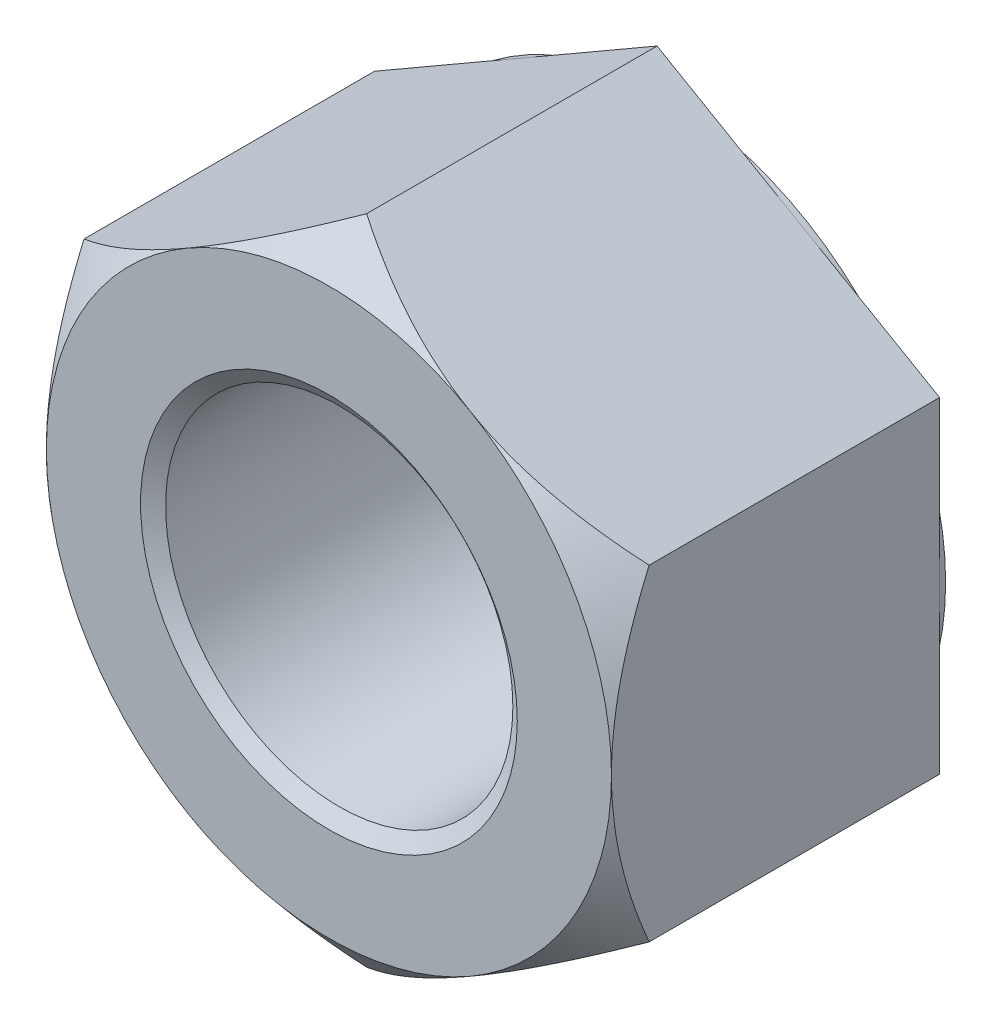
ISO-10303-21;
HEADER;
FILE_DESCRIPTION(('STEP AP214'),'2;1');
FILE_NAME('part.step','',(''),(''),'','','');
FILE_SCHEMA(('AUTOMOTIVE_DESIGN { 1 0 10303 214 1 1 1 1 }'));
ENDSEC;
DATA;
#1=APPLICATION_CONTEXT('core data for automotive mechanical design processes');
#2=APPLICATION_PROTOCOL_DEFINITION('international standard','automotive_design',2000,#1);
#3=PRODUCT_CONTEXT('',#1,'mechanical');
#4=PRODUCT('Part','Part','',(#3));
#5=PRODUCT_RELATED_PRODUCT_CATEGORY('part','',(#4));
#6=PRODUCT_DEFINITION_FORMATION('','',#4);
#7=PRODUCT_DEFINITION_CONTEXT('part definition',#1,'design');
#8=PRODUCT_DEFINITION('design','',#6,#7);
#9=PRODUCT_DEFINITION_SHAPE('','',#8);
#10=(LENGTH_UNIT() NAMED_UNIT(*) SI_UNIT(.MILLI.,.METRE.));
#11=(NAMED_UNIT(*) PLANE_ANGLE_UNIT() SI_UNIT($,.RADIAN.));
#12=(NAMED_UNIT(*) SI_UNIT($,.STERADIAN.) SOLID_ANGLE_UNIT());
#13=UNCERTAINTY_MEASURE_WITH_UNIT(LENGTH_MEASURE(1.E-05),#10,'distance_accuracy_value','');
#14=(GEOMETRIC_REPRESENTATION_CONTEXT(3) GLOBAL_UNCERTAINTY_ASSIGNED_CONTEXT((#13)) GLOBAL_UNIT_ASSIGNED_CONTEXT((#10,
#11,#12)) REPRESENTATION_CONTEXT('',''));
#15=CARTESIAN_POINT('',(0.,0.,0.));
#16=DIRECTION('',(0.,0.,1.));
#17=DIRECTION('',(1.,0.,0.));
#18=AXIS2_PLACEMENT_3D('',#15,#16,#17);
#19=CARTESIAN_POINT('',(0.,0.,-22.5298));
#20=DIRECTION('',(0.,0.,1.));
#21=DIRECTION('',(1.,0.,0.));
#22=AXIS2_PLACEMENT_3D('',#19,#20,#21);
#23=CYLINDRICAL_SURFACE('',#22,11.70813);
#24=CARTESIAN_POINT('',(0.,0.,-0.694514850924055));
#25=DIRECTION('',(0.,0.,1.));
#26=DIRECTION('',(1.,0.,0.));
#27=AXIS2_PLACEMENT_3D('',#24,#25,#26);
#28=CIRCLE('',#27,11.70813);
#29=CARTESIAN_POINT('',(11.70813,0.,-0.694514850924055));
#30=VERTEX_POINT('',#29);
#31=EDGE_CURVE('E150',#30,#30,#28,.F.);
#32=ORIENTED_EDGE('',*,*,#31,.F.);
#33=EDGE_LOOP('',(#32));
#34=FACE_BOUND('',#33,.T.);
#35=CARTESIAN_POINT('',(0.,0.,-21.8098851490759));
#36=DIRECTION('',(0.,0.,-1.));
#37=DIRECTION('',(-1.,0.,0.));
#38=AXIS2_PLACEMENT_3D('',#35,#36,#37);
#39=CIRCLE('',#38,11.70813);
#40=CARTESIAN_POINT('',(-11.70813,0.,-21.8098851490759));
#41=VERTEX_POINT('',#40);
#42=EDGE_CURVE('E38',#41,#41,#39,.F.);
#43=ORIENTED_EDGE('',*,*,#42,.F.);
#44=EDGE_LOOP('',(#43));
#45=FACE_BOUND('',#44,.T.);
#46=ADVANCED_FACE('F33',(#34,#45),#23,.F.);
#47=CARTESIAN_POINT('',(0.,21.9970452561247,-22.5298));
#48=DIRECTION('',(-0.5,0.866025403784438,0.));
#49=DIRECTION('',(-0.866025403784438,-0.5,0.));
#50=AXIS2_PLACEMENT_3D('',#47,#48,#49);
#51=PLANE('',#50);
#52=DIRECTION('',(0.,0.,1.));
#53=VECTOR('',#52,1.);
#54=CARTESIAN_POINT('',(-19.05,10.9985226280624,-22.5298));
#55=LINE('',#54,#53);
#56=CARTESIAN_POINT('',(-19.05,10.9985226280624,-22.1234));
#57=VERTEX_POINT('',#56);
#58=CARTESIAN_POINT('',(-19.05,10.9985226280624,-2.54));
#59=VERTEX_POINT('',#58);
#60=EDGE_CURVE('E282',#57,#59,#55,.T.);
#61=ORIENTED_EDGE('',*,*,#60,.T.);
#62=CARTESIAN_POINT('',(-19.0502,10.9984071580085,-2.54009952213849));
#63=CARTESIAN_POINT('',(-18.6766639855738,11.2140682764895,-2.35425451379221));
#64=CARTESIAN_POINT('',(-18.3004987158653,11.4312473962155,-2.17523809705124));
#65=CARTESIAN_POINT('',(-17.5425520403765,11.8688481133404,-1.83307180263063));
#66=CARTESIAN_POINT('',(-17.1607674659696,12.0892715401466,-1.66993130516963));
#67=CARTESIAN_POINT('',(-16.3897113206679,12.5344410131968,-1.3611684029933));
#68=CARTESIAN_POINT('',(-16.0004115857015,12.7592033199752,-1.21563910791352));
#69=CARTESIAN_POINT('',(-15.216398258664,13.2118536253885,-0.945694898655021));
#70=CARTESIAN_POINT('',(-14.8216855849419,13.4397410938145,-0.82127644959926));
#71=CARTESIAN_POINT('',(-14.0342916648806,13.8943431855202,-0.598191618896152));
#72=CARTESIAN_POINT('',(-13.6417004785289,14.1210058126418,-0.499104223518349));
#73=CARTESIAN_POINT('',(-12.852318337895,14.5767558040303,-0.326215026473438));
#74=CARTESIAN_POINT('',(-12.4555272588972,14.8058432403017,-0.252413977867097));
#75=CARTESIAN_POINT('',(-11.6597061794376,15.2653107547545,-0.132260395738475));
#76=CARTESIAN_POINT('',(-11.2606830445542,15.4956868690923,-0.0858477001342909));
#77=CARTESIAN_POINT('',(-10.4609191442254,15.9574307722353,-0.0216165971278409));
#78=CARTESIAN_POINT('',(-10.0601785045138,16.188798488448,-0.00379613124170322));
#79=CARTESIAN_POINT('',(-9.31450866794628,16.6193111693169,0.00225310916662124));
#80=CARTESIAN_POINT('',(-8.96959863448719,16.8184450699807,-0.00573407810545133));
#81=CARTESIAN_POINT('',(-8.28065896680875,17.2162045725702,-0.0430781586509624));
#82=CARTESIAN_POINT('',(-7.9366293034092,17.4148301913432,-0.0724343341879413));
#83=CARTESIAN_POINT('',(-7.25012577160561,17.8111831902296,-0.151878622342599));
#84=CARTESIAN_POINT('',(-6.90765324370967,18.0089097964004,-0.20198206882495));
#85=CARTESIAN_POINT('',(-6.22530999936825,18.4028608522006,-0.321846286833533));
#86=CARTESIAN_POINT('',(-5.88543932042931,18.5990852801757,-0.391607341184942));
#87=CARTESIAN_POINT('',(-5.20886184729644,18.9897074664166,-0.549433846264761));
#88=CARTESIAN_POINT('',(-4.87215552765403,19.1841049507,-0.63750199808612));
#89=CARTESIAN_POINT('',(-4.2023492206137,19.5708178023746,-0.830408468804725));
#90=CARTESIAN_POINT('',(-3.86924977950534,19.7631328543654,-0.935249291145561));
#91=CARTESIAN_POINT('',(-2.87609571840607,20.3365306188879,-1.2724157037246));
#92=CARTESIAN_POINT('',(-2.22175506329323,20.714314372259,-1.52748945926886));
#93=CARTESIAN_POINT('',(-1.30991685119032,21.240764409474,-1.92140953010559));
#94=CARTESIAN_POINT('',(-1.04568446920167,21.3933190463438,-2.04022275177846));
#95=CARTESIAN_POINT('',(-0.520499849760543,21.6965345277523,-2.28495691248877));
#96=CARTESIAN_POINT('',(-0.259540846314214,21.8471992786395,-2.41085847151859));
#97=CARTESIAN_POINT('',(0.000200000000005041,21.9971607261786,-2.54009952213847));
#98=B_SPLINE_CURVE_WITH_KNOTS('',3,(#62,#63,#64,#65,#66,#67,#68,#69,#70,#71,#72,#73,#74,#75,#76,
#77,#78,#79,#80,#81,#82,#83,#84,#85,#86,#87,#88,#89,#90,#91,#92,#93,#94,#95,#96,#97),
.UNSPECIFIED.,.F.,.F.,(4,2,2,2,2,2,2,2,2,2,2,2,2,2,2,2,2,4),(0.,1.40903860406288,
2.81890474120159,4.23592620850326,5.65271016991147,7.04413924364017,8.43560975236122,
9.82401222617536,11.212314738133,12.4067918232825,13.6012287904728,14.7965501205998,
15.9918886493724,17.1874036678946,18.3830972925295,20.7729660282076,21.7551941199548,
22.7348561182917),.UNSPECIFIED.);
#99=CARTESIAN_POINT('',(-9.52500000000001,16.4977839420936,0.));
#100=VERTEX_POINT('',#99);
#101=EDGE_CURVE('E136',#59,#100,#98,.T.);
#102=ORIENTED_EDGE('',*,*,#101,.T.);
#103=CARTESIAN_POINT('',(0.,21.9970452561247,-2.54));
#104=VERTEX_POINT('',#103);
#105=EDGE_CURVE('E163',#100,#104,#98,.T.);
#106=ORIENTED_EDGE('',*,*,#105,.T.);
#107=DIRECTION('',(0.,0.,1.));
#108=VECTOR('',#107,1.);
#109=CARTESIAN_POINT('',(0.,21.9970452561247,-22.5298));
#110=LINE('',#109,#108);
#111=CARTESIAN_POINT('',(0.,21.9970452561247,-22.1234));
#112=VERTEX_POINT('',#111);
#113=EDGE_CURVE('E270',#112,#104,#110,.T.);
#114=ORIENTED_EDGE('',*,*,#113,.F.);
#115=DIRECTION('',(-0.866025403784438,-0.5,0.));
#116=VECTOR('',#115,1.);
#117=CARTESIAN_POINT('',(0.,21.9970452561247,-22.1234));
#118=LINE('',#117,#116);
#119=CARTESIAN_POINT('',(-9.52500000000001,16.4977839420936,-22.1234));
#120=VERTEX_POINT('',#119);
#121=EDGE_CURVE('E258',#112,#120,#118,.T.);
#122=ORIENTED_EDGE('',*,*,#121,.T.);
#123=EDGE_CURVE('E254',#120,#57,#118,.T.);
#124=ORIENTED_EDGE('',*,*,#123,.T.);
#125=EDGE_LOOP('',(#61,#102,#106,#114,#122,#124));
#126=FACE_BOUND('',#125,.T.);
#127=ADVANCED_FACE('F35',(#126),#51,.T.);
#128=CARTESIAN_POINT('',(19.05,10.9985226280624,-22.5298));
#129=DIRECTION('',(0.5,0.866025403784439,0.));
#130=DIRECTION('',(-0.866025403784439,0.5,0.));
#131=AXIS2_PLACEMENT_3D('',#128,#129,#130);
#132=PLANE('',#131);
#133=ORIENTED_EDGE('',*,*,#113,.T.);
#134=CARTESIAN_POINT('',(-0.000200000000004576,21.9971607261786,-2.5400995221385));
#135=CARTESIAN_POINT('',(0.373336014426207,21.7814996076976,-2.35425451379222));
#136=CARTESIAN_POINT('',(0.749501284134725,21.5643204879716,-2.17523809705124));
#137=CARTESIAN_POINT('',(1.50744795962354,21.1267197708467,-1.83307180263064));
#138=CARTESIAN_POINT('',(1.88923253403042,20.9062963440405,-1.66993130516964));
#139=CARTESIAN_POINT('',(2.66028867933205,20.4611268709903,-1.3611684029933));
#140=CARTESIAN_POINT('',(3.04958841429848,20.236364564212,-1.21563910791353));
#141=CARTESIAN_POINT('',(3.83360174133601,19.7837142587986,-0.945694898655026));
#142=CARTESIAN_POINT('',(4.22831441505808,19.5558267903726,-0.821276449599265));
#143=CARTESIAN_POINT('',(5.01570833511943,19.1012246986669,-0.598191618896155));
#144=CARTESIAN_POINT('',(5.4082995214711,18.8745620715453,-0.499104223518351));
#145=CARTESIAN_POINT('',(6.19768166210499,18.4188120801568,-0.326215026473441));
#146=CARTESIAN_POINT('',(6.59447274110284,18.1897246438854,-0.252413977867101));
#147=CARTESIAN_POINT('',(7.39029382056238,17.7302571294326,-0.132260395738479));
#148=CARTESIAN_POINT('',(7.78931695544577,17.4998810150948,-0.0858477001342926));
#149=CARTESIAN_POINT('',(8.58908085577464,17.0381371119518,-0.0216165971278422));
#150=CARTESIAN_POINT('',(8.98982149548619,16.8067693957391,-0.00379613124170649));
#151=CARTESIAN_POINT('',(9.73549133205373,16.3762567148703,0.00225310916661852));
#152=CARTESIAN_POINT('',(10.0804013655128,16.1771228142064,-0.00573407810545215));
#153=CARTESIAN_POINT('',(10.7693410331913,15.7793633116169,-0.0430781586509615));
#154=CARTESIAN_POINT('',(11.1133706965908,15.5807376928439,-0.0724343341879406));
#155=CARTESIAN_POINT('',(11.7998742283944,15.1843846939575,-0.1518786223426));
#156=CARTESIAN_POINT('',(12.1423467562903,14.9866580877867,-0.201982068824953));
#157=CARTESIAN_POINT('',(12.8246900006318,14.5927070319865,-0.321846286833535));
#158=CARTESIAN_POINT('',(13.1645606795707,14.3964826040114,-0.391607341184942));
#159=CARTESIAN_POINT('',(13.8411381527036,14.0058604177705,-0.549433846264761));
#160=CARTESIAN_POINT('',(14.177844472346,13.8114629334871,-0.637501998086123));
#161=CARTESIAN_POINT('',(14.8476507793863,13.4247500818125,-0.830408468804729));
#162=CARTESIAN_POINT('',(15.1807502204947,13.2324350298217,-0.935249291145565));
#163=CARTESIAN_POINT('',(16.1739042815939,12.6590372652992,-1.2724157037246));
#164=CARTESIAN_POINT('',(16.8282449367068,12.2812535119281,-1.52748945926887));
#165=CARTESIAN_POINT('',(17.7400831488097,11.7548034747131,-1.92140953010559));
#166=CARTESIAN_POINT('',(18.0043155307983,11.6022488378434,-2.04022275177846));
#167=CARTESIAN_POINT('',(18.5295001502395,11.2990333564348,-2.28495691248877));
#168=CARTESIAN_POINT('',(18.7904591536858,11.1483686055476,-2.41085847151859));
#169=CARTESIAN_POINT('',(19.0502,10.9984071580085,-2.54009952213847));
#170=B_SPLINE_CURVE_WITH_KNOTS('',3,(#134,#135,#136,#137,#138,#139,#140,#141,#142,#143,#144,
#145,#146,#147,#148,#149,#150,#151,#152,#153,#154,#155,#156,#157,#158,#159,#160,#161,#162,#163,
#164,#165,#166,#167,#168,#169),.UNSPECIFIED.,.F.,.F.,(4,2,2,2,2,2,2,2,2,2,2,2,2,2,2,2,2,4),(0.,
1.40903860406288,2.81890474120159,4.23592620850326,5.65271016991147,7.04413924364018,
8.43560975236123,9.82401222617537,11.212314738133,12.4067918232825,13.6012287904729,
14.7965501205999,15.9918886493724,17.1874036678946,18.3830972925295,20.7729660282076,
21.7551941199548,22.7348561182917),.UNSPECIFIED.);
#171=CARTESIAN_POINT('',(9.525,16.4977839420936,0.));
#172=VERTEX_POINT('',#171);
#173=EDGE_CURVE('E159',#104,#172,#170,.T.);
#174=ORIENTED_EDGE('',*,*,#173,.T.);
#175=CARTESIAN_POINT('',(19.05,10.9985226280624,-2.54));
#176=VERTEX_POINT('',#175);
#177=EDGE_CURVE('E145',#172,#176,#170,.T.);
#178=ORIENTED_EDGE('',*,*,#177,.T.);
#179=DIRECTION('',(0.,0.,1.));
#180=VECTOR('',#179,1.);
#181=CARTESIAN_POINT('',(19.05,10.9985226280624,-22.5298));
#182=LINE('',#181,#180);
#183=CARTESIAN_POINT('',(19.05,10.9985226280624,-22.1234));
#184=VERTEX_POINT('',#183);
#185=EDGE_CURVE('E158',#184,#176,#182,.T.);
#186=ORIENTED_EDGE('',*,*,#185,.F.);
#187=DIRECTION('',(-0.866025403784439,0.5,0.));
#188=VECTOR('',#187,1.);
#189=CARTESIAN_POINT('',(19.05,10.9985226280624,-22.1234));
#190=LINE('',#189,#188);
#191=CARTESIAN_POINT('',(9.525,16.4977839420936,-22.1234));
#192=VERTEX_POINT('',#191);
#193=EDGE_CURVE('E266',#184,#192,#190,.T.);
#194=ORIENTED_EDGE('',*,*,#193,.T.);
#195=EDGE_CURVE('E262',#192,#112,#190,.T.);
#196=ORIENTED_EDGE('',*,*,#195,.T.);
#197=EDGE_LOOP('',(#133,#174,#178,#186,#194,#196));
#198=FACE_BOUND('',#197,.T.);
#199=ADVANCED_FACE('F230',(#198),#132,.T.);
#200=CARTESIAN_POINT('',(19.05,10.9985226280624,-22.5298));
#201=DIRECTION('',(-1.,0.,0.));
#202=DIRECTION('',(0.,0.,1.));
#203=AXIS2_PLACEMENT_3D('',#200,#201,#202);
#204=PLANE('',#203);
#205=CARTESIAN_POINT('',(19.05,-24.3459075374594,-10.2246542980684));
#206=CARTESIAN_POINT('',(19.05,-24.0379512069638,-10.0156234524869));
#207=CARTESIAN_POINT('',(19.05,-23.7292990537459,-9.80761844359138));
#208=CARTESIAN_POINT('',(19.05,-23.11048047233,-9.39386332496007));
#209=CARTESIAN_POINT('',(19.05,-22.8003140207044,-9.18811325027104));
#210=CARTESIAN_POINT('',(19.05,-21.8672452781252,-8.57447554973355));
#211=CARTESIAN_POINT('',(19.05,-21.2419006146082,-8.17028689797528));
#212=CARTESIAN_POINT('',(19.05,-19.9791742337614,-7.37102642262092));
#213=CARTESIAN_POINT('',(19.05,-19.341738601907,-6.97603958653804));
#214=CARTESIAN_POINT('',(19.05,-18.0579249384145,-6.20092021684231));
#215=CARTESIAN_POINT('',(19.05,-17.4115474736592,-5.82078674736538));
#216=CARTESIAN_POINT('',(19.05,-16.0729603420177,-5.05871710385408));
#217=CARTESIAN_POINT('',(19.05,-15.3801665795744,-4.67780184442072));
#218=CARTESIAN_POINT('',(19.05,-13.9808571514277,-3.94162489425578));
#219=CARTESIAN_POINT('',(19.05,-13.2743394934979,-3.58636696391825));
#220=CARTESIAN_POINT('',(19.05,-11.8476157746976,-2.90950019127138));
#221=CARTESIAN_POINT('',(19.05,-11.1274521884048,-2.58780242460903));
#222=CARTESIAN_POINT('',(19.05,-9.67001173369457,-1.98596610906477));
#223=CARTESIAN_POINT('',(19.05,-8.93274207524558,-1.7058104059887));
#224=CARTESIAN_POINT('',(19.05,-7.82393239282057,-1.32849768621635));
#225=CARTESIAN_POINT('',(19.05,-7.45917391860538,-1.21129077930719));
#226=CARTESIAN_POINT('',(19.05,-6.72549523899494,-0.990662801178611));
#227=CARTESIAN_POINT('',(19.05,-6.35657515805884,-0.887241318864535));
#228=CARTESIAN_POINT('',(19.05,-5.61476663804911,-0.695590821313896));
#229=CARTESIAN_POINT('',(19.05,-5.24187791843553,-0.607362887773496));
#230=CARTESIAN_POINT('',(19.05,-4.49256590032379,-0.447495433736289));
#231=CARTESIAN_POINT('',(19.05,-4.11614282245058,-0.375854884876294));
#232=CARTESIAN_POINT('',(19.05,-3.36734414758455,-0.251582203410184));
#233=CARTESIAN_POINT('',(19.05,-2.99502332047463,-0.198621585378703));
#234=CARTESIAN_POINT('',(19.05,-2.24823631127503,-0.110872862916481));
#235=CARTESIAN_POINT('',(19.05,-1.87377014626457,-0.0760846140167619));
#236=CARTESIAN_POINT('',(19.05,-1.12358758159645,-0.0253762781824038));
#237=CARTESIAN_POINT('',(19.05,-0.747871291052263,-0.00945458572444282));
#238=CARTESIAN_POINT('',(19.05,0.00388322082345652,0.00319446816915518));
#239=CARTESIAN_POINT('',(19.05,0.379921437421473,-7.78928581193832E-05));
#240=CARTESIAN_POINT('',(19.05,1.10621604195936,-0.0248865534509027));
#241=CARTESIAN_POINT('',(19.05,1.45651547366972,-0.0451872956174469));
#242=CARTESIAN_POINT('',(19.05,2.15577979663635,-0.102073017262694));
#243=CARTESIAN_POINT('',(19.05,2.50474470708645,-0.138657761640754));
#244=CARTESIAN_POINT('',(19.05,3.20068004276666,-0.227487483872292));
#245=CARTESIAN_POINT('',(19.05,3.54765038398029,-0.279733116547992));
#246=CARTESIAN_POINT('',(19.05,4.239024591163,-0.399049093139755));
#247=CARTESIAN_POINT('',(19.05,4.58342842740544,-0.466119608490506));
#248=CARTESIAN_POINT('',(19.05,5.27636069357905,-0.61564264596701));
#249=CARTESIAN_POINT('',(19.05,5.62482618158275,-0.698385763614129));
#250=CARTESIAN_POINT('',(19.05,6.31831750909542,-0.877169015232237));
#251=CARTESIAN_POINT('',(19.05,6.66334331801944,-0.973209267325881));
#252=CARTESIAN_POINT('',(19.05,7.34968342547198,-1.17740366638863));
#253=CARTESIAN_POINT('',(19.05,7.6909986572906,-1.28555468610061));
#254=CARTESIAN_POINT('',(19.05,8.36991903456586,-1.51285226593051));
#255=CARTESIAN_POINT('',(19.05,8.70752428025517,-1.63199852816867));
#256=CARTESIAN_POINT('',(19.05,9.65791189316004,-1.98326904968756));
#257=CARTESIAN_POINT('',(19.05,10.266402307517,-2.22705167458204));
#258=CARTESIAN_POINT('',(19.05,11.4718022743803,-2.7418971540836));
#259=CARTESIAN_POINT('',(19.05,12.0687084544403,-3.01296781489304));
#260=CARTESIAN_POINT('',(19.05,13.2524946962949,-3.57769190265617));
#261=CARTESIAN_POINT('',(19.05,13.8393630311572,-3.87136979601064));
#262=CARTESIAN_POINT('',(19.05,15.0034964057176,-4.47697100962179));
#263=CARTESIAN_POINT('',(19.05,15.5807622733937,-4.7888927462088));
#264=CARTESIAN_POINT('',(19.05,16.7303491610068,-5.42969693301642));
#265=CARTESIAN_POINT('',(19.05,17.3026192235196,-5.75867048080905));
#266=CARTESIAN_POINT('',(19.05,18.4397284220632,-6.42920514869048));
#267=CARTESIAN_POINT('',(19.05,19.0045674239692,-6.77076649555735));
#268=CARTESIAN_POINT('',(19.05,20.1274427073301,-7.46417938830807));
#269=CARTESIAN_POINT('',(19.05,20.6854826112787,-7.81602508168151));
#270=CARTESIAN_POINT('',(19.05,21.7959051663133,-8.52850677804265));
#271=CARTESIAN_POINT('',(19.05,22.3482878665499,-8.88914270456713));
#272=CARTESIAN_POINT('',(19.05,23.3937948831553,-9.5818625739389));
#273=CARTESIAN_POINT('',(19.05,23.8873828346848,-9.91324794644134));
#274=CARTESIAN_POINT('',(19.05,24.8710024747521,-10.5812589063367));
#275=CARTESIAN_POINT('',(19.05,25.3610341268738,-10.9178845472787));
#276=CARTESIAN_POINT('',(19.05,26.8265263654425,-11.9346577154897));
#277=CARTESIAN_POINT('',(19.05,27.7972635726381,-12.6216210531312));
#278=CARTESIAN_POINT('',(19.05,29.2394294564254,-13.657937223494));
#279=CARTESIAN_POINT('',(19.05,29.7146709812716,-14.0020163043803));
#280=CARTESIAN_POINT('',(19.05,30.6629492014474,-14.6932049758986));
#281=CARTESIAN_POINT('',(19.05,31.1359858922559,-15.0403145727407));
#282=CARTESIAN_POINT('',(19.05,32.0799512424443,-15.7371278632301));
#283=CARTESIAN_POINT('',(19.05,32.5508804216474,-16.0868308534117));
#284=CARTESIAN_POINT('',(19.05,33.4909382861024,-16.7886392421585));
#285=CARTESIAN_POINT('',(19.05,33.9600669892916,-17.1407446166921));
#286=CARTESIAN_POINT('',(19.05,34.4283915679097,-17.4939138935292));
#287=B_SPLINE_CURVE_WITH_KNOTS('',3,(#205,#206,#207,#208,#209,#210,#211,#212,#213,#214,#215,
#216,#217,#218,#219,#220,#221,#222,#223,#224,#225,#226,#227,#228,#229,#230,#231,#232,#233,#234,
#235,#236,#237,#238,#239,#240,#241,#242,#243,#244,#245,#246,#247,#248,#249,#250,#251,#252,#253,
#254,#255,#256,#257,#258,#259,#260,#261,#262,#263,#264,#265,#266,#267,#268,#269,#270,#271,#272,
#273,#274,#275,#276,#277,#278,#279,#280,#281,#282,#283,#284,#285,#286),.UNSPECIFIED.,.F.,.F.,(4,
2,2,2,2,2,2,2,2,2,2,2,2,2,2,2,2,2,2,2,2,2,2,2,2,2,2,2,2,2,2,2,2,2,2,2,2,2,2,2,4),(0.,
1.11658874094305,2.2331948116707,4.4668678381228,6.71638233057558,8.96575485886595,
11.3371532669829,13.708898530055,16.0741906139444,18.4385032483437,19.5876623631442,
20.7367872012411,21.8859938168425,23.0351291663321,24.1629107307877,25.2906833293276,
26.4183599487586,27.5460202625504,28.598297136798,29.6505588192677,30.7028645056571,
31.7551823615279,32.8293606175663,33.9035484164824,34.9774594741726,36.0513414463297,
38.0169695804518,39.9831616221862,41.951512303792,43.9196923741895,45.8997653645259,
47.8798740447255,49.8588770394999,51.8378628257447,53.6213628004889,55.4048810123685,
58.9723524037174,60.7325177354189,62.4926866748788,64.2523944594951,66.0120846671883),.UNSPECIFIED.);
#288=CARTESIAN_POINT('',(19.05,-10.9985226280624,-2.54));
#289=VERTEX_POINT('',#288);
#290=CARTESIAN_POINT('',(19.05,0.,0.));
#291=VERTEX_POINT('',#290);
#292=EDGE_CURVE('E125',#289,#291,#287,.T.);
#293=ORIENTED_EDGE('',*,*,#292,.F.);
#294=DIRECTION('',(0.,0.,1.));
#295=VECTOR('',#294,1.);
#296=CARTESIAN_POINT('',(19.05,-10.9985226280624,-22.5298));
#297=LINE('',#296,#295);
#298=CARTESIAN_POINT('',(19.05,-10.9985226280624,-22.1234));
#299=VERTEX_POINT('',#298);
#300=EDGE_CURVE('E275',#299,#289,#297,.T.);
#301=ORIENTED_EDGE('',*,*,#300,.F.);
#302=DIRECTION('',(0.,-1.,0.));
#303=VECTOR('',#302,1.);
#304=CARTESIAN_POINT('',(19.05,10.9985226280624,-22.1234));
#305=LINE('',#304,#303);
#306=CARTESIAN_POINT('',(19.05,0.,-22.1234));
#307=VERTEX_POINT('',#306);
#308=EDGE_CURVE('E267',#307,#299,#305,.T.);
#309=ORIENTED_EDGE('',*,*,#308,.F.);
#310=EDGE_CURVE('E269',#184,#307,#305,.T.);
#311=ORIENTED_EDGE('',*,*,#310,.F.);
#312=ORIENTED_EDGE('',*,*,#185,.T.);
#313=EDGE_CURVE('E138',#291,#176,#287,.T.);
#314=ORIENTED_EDGE('',*,*,#313,.F.);
#315=EDGE_LOOP('',(#293,#301,#309,#311,#312,#314));
#316=FACE_BOUND('',#315,.T.);
#317=ADVANCED_FACE('F155',(#316),#204,.F.);
#318=CARTESIAN_POINT('',(0.,-21.9970452561248,-22.5298));
#319=DIRECTION('',(0.500000000000001,-0.866025403784438,0.));
#320=DIRECTION('',(0.866025403784438,0.500000000000001,0.));
#321=AXIS2_PLACEMENT_3D('',#318,#319,#320);
#322=PLANE('',#321);
#323=ORIENTED_EDGE('',*,*,#300,.T.);
#324=CARTESIAN_POINT('',(19.0502,-10.9984071580085,-2.5400995221385));
#325=CARTESIAN_POINT('',(18.6766639855738,-11.2140682764895,-2.35425451379222));
#326=CARTESIAN_POINT('',(18.3004987158653,-11.4312473962155,-2.17523809705124));
#327=CARTESIAN_POINT('',(17.5425520403765,-11.8688481133404,-1.83307180263063));
#328=CARTESIAN_POINT('',(17.1607674659696,-12.0892715401466,-1.66993130516964));
#329=CARTESIAN_POINT('',(16.3897113206679,-12.5344410131969,-1.36116840299331));
#330=CARTESIAN_POINT('',(16.0004115857015,-12.7592033199752,-1.21563910791353));
#331=CARTESIAN_POINT('',(15.216398258664,-13.2118536253885,-0.945694898655031));
#332=CARTESIAN_POINT('',(14.8216855849419,-13.4397410938145,-0.821276449599268));
#333=CARTESIAN_POINT('',(14.0342916648806,-13.8943431855202,-0.598191618896157));
#334=CARTESIAN_POINT('',(13.6417004785289,-14.1210058126418,-0.499104223518354));
#335=CARTESIAN_POINT('',(12.852318337895,-14.5767558040303,-0.326215026473445));
#336=CARTESIAN_POINT('',(12.4555272588972,-14.8058432403018,-0.252413977867106));
#337=CARTESIAN_POINT('',(11.6597061794376,-15.2653107547545,-0.132260395738486));
#338=CARTESIAN_POINT('',(11.2606830445542,-15.4956868690923,-0.0858477001343007));
#339=CARTESIAN_POINT('',(10.4609191442254,-15.9574307722353,-0.0216165971278505));
#340=CARTESIAN_POINT('',(10.0601785045138,-16.188798488448,-0.00379613124171319));
#341=CARTESIAN_POINT('',(9.31450866794628,-16.6193111693169,0.00225310916661175));
#342=CARTESIAN_POINT('',(8.96959863448719,-16.8184450699807,-0.00573407810546016));
#343=CARTESIAN_POINT('',(8.28065896680875,-17.2162045725702,-0.04307815865097));
#344=CARTESIAN_POINT('',(7.93662930340921,-17.4148301913432,-0.0724343341879483));
#345=CARTESIAN_POINT('',(7.25012577160562,-17.8111831902296,-0.151878622342608));
#346=CARTESIAN_POINT('',(6.90765324370968,-18.0089097964004,-0.201982068824962));
#347=CARTESIAN_POINT('',(6.22530999936825,-18.4028608522006,-0.321846286833545));
#348=CARTESIAN_POINT('',(5.88543932042931,-18.5990852801757,-0.391607341184951));
#349=CARTESIAN_POINT('',(5.20886184729644,-18.9897074664166,-0.549433846264769));
#350=CARTESIAN_POINT('',(4.87215552765403,-19.1841049507,-0.637501998086131));
#351=CARTESIAN_POINT('',(4.2023492206137,-19.5708178023746,-0.830408468804737));
#352=CARTESIAN_POINT('',(3.86924977950535,-19.7631328543654,-0.935249291145573));
#353=CARTESIAN_POINT('',(2.87609571840608,-20.3365306188879,-1.27241570372461));
#354=CARTESIAN_POINT('',(2.22175506329323,-20.714314372259,-1.52748945926887));
#355=CARTESIAN_POINT('',(1.30991685119032,-21.240764409474,-1.9214095301056));
#356=CARTESIAN_POINT('',(1.04568446920167,-21.3933190463438,-2.04022275177847));
#357=CARTESIAN_POINT('',(0.520499849760546,-21.6965345277524,-2.28495691248878));
#358=CARTESIAN_POINT('',(0.259540846314216,-21.8471992786395,-2.41085847151861));
#359=CARTESIAN_POINT('',(-0.000200000000005426,-21.9971607261786,-2.54009952213849));
#360=B_SPLINE_CURVE_WITH_KNOTS('',3,(#324,#325,#326,#327,#328,#329,#330,#331,#332,#333,#334,
#335,#336,#337,#338,#339,#340,#341,#342,#343,#344,#345,#346,#347,#348,#349,#350,#351,#352,#353,
#354,#355,#356,#357,#358,#359),.UNSPECIFIED.,.F.,.F.,(4,2,2,2,2,2,2,2,2,2,2,2,2,2,2,2,2,4),(0.,
1.40903860406288,2.81890474120159,4.23592620850325,5.65271016991146,7.04413924364016,
8.43560975236121,9.82401222617536,11.212314738133,12.4067918232825,13.6012287904728,
14.7965501205998,15.9918886493724,17.1874036678946,18.3830972925295,20.7729660282076,
21.7551941199548,22.7348561182917),.UNSPECIFIED.);
#361=CARTESIAN_POINT('',(9.52500000000001,-16.4977839420936,0.));
#362=VERTEX_POINT('',#361);
#363=EDGE_CURVE('E131',#289,#362,#360,.T.);
#364=ORIENTED_EDGE('',*,*,#363,.T.);
#365=CARTESIAN_POINT('',(0.,-21.9970452561247,-2.54));
#366=VERTEX_POINT('',#365);
#367=EDGE_CURVE('E52',#362,#366,#360,.T.);
#368=ORIENTED_EDGE('',*,*,#367,.T.);
#369=DIRECTION('',(0.,0.,1.));
#370=VECTOR('',#369,1.);
#371=CARTESIAN_POINT('',(0.,-21.9970452561248,-22.5298));
#372=LINE('',#371,#370);
#373=CARTESIAN_POINT('',(0.,-21.9970452561248,-22.1234));
#374=VERTEX_POINT('',#373);
#375=EDGE_CURVE('E277',#374,#366,#372,.T.);
#376=ORIENTED_EDGE('',*,*,#375,.F.);
#377=DIRECTION('',(0.866025403784438,0.500000000000001,0.));
#378=VECTOR('',#377,1.);
#379=CARTESIAN_POINT('',(0.,-21.9970452561248,-22.1234));
#380=LINE('',#379,#378);
#381=CARTESIAN_POINT('',(9.52500000000002,-16.4977839420936,-22.1234));
#382=VERTEX_POINT('',#381);
#383=EDGE_CURVE('E259',#374,#382,#380,.T.);
#384=ORIENTED_EDGE('',*,*,#383,.T.);
#385=EDGE_CURVE('E263',#382,#299,#380,.T.);
#386=ORIENTED_EDGE('',*,*,#385,.T.);
#387=EDGE_LOOP('',(#323,#364,#368,#376,#384,#386));
#388=FACE_BOUND('',#387,.T.);
#389=ADVANCED_FACE('F211',(#388),#322,.T.);
#390=CARTESIAN_POINT('',(-19.05,-10.9985226280624,-22.5298));
#391=DIRECTION('',(-0.5,-0.866025403784439,0.));
#392=DIRECTION('',(0.866025403784439,-0.5,0.));
#393=AXIS2_PLACEMENT_3D('',#390,#391,#392);
#394=PLANE('',#393);
#395=ORIENTED_EDGE('',*,*,#375,.T.);
#396=CARTESIAN_POINT('',(0.000200000000003005,-21.9971607261786,-2.54009952213851));
#397=CARTESIAN_POINT('',(-0.373336014426209,-21.7814996076976,-2.35425451379223));
#398=CARTESIAN_POINT('',(-0.749501284134728,-21.5643204879716,-2.17523809705126));
#399=CARTESIAN_POINT('',(-1.50744795962355,-21.1267197708468,-1.83307180263065));
#400=CARTESIAN_POINT('',(-1.88923253403043,-20.9062963440405,-1.66993130516965));
#401=CARTESIAN_POINT('',(-2.66028867933205,-20.4611268709903,-1.36116840299331));
#402=CARTESIAN_POINT('',(-3.04958841429848,-20.236364564212,-1.21563910791354));
#403=CARTESIAN_POINT('',(-3.83360174133601,-19.7837142587986,-0.945694898655039));
#404=CARTESIAN_POINT('',(-4.22831441505808,-19.5558267903726,-0.821276449599277));
#405=CARTESIAN_POINT('',(-5.01570833511943,-19.1012246986669,-0.598191618896168));
#406=CARTESIAN_POINT('',(-5.40829952147109,-18.8745620715453,-0.499104223518364));
#407=CARTESIAN_POINT('',(-6.19768166210499,-18.4188120801568,-0.326215026473453));
#408=CARTESIAN_POINT('',(-6.59447274110284,-18.1897246438854,-0.252413977867113));
#409=CARTESIAN_POINT('',(-7.39029382056238,-17.7302571294326,-0.132260395738491));
#410=CARTESIAN_POINT('',(-7.78931695544577,-17.4998810150948,-0.0858477001343051));
#411=CARTESIAN_POINT('',(-8.58908085577464,-17.0381371119518,-0.0216165971278521));
#412=CARTESIAN_POINT('',(-8.98982149548619,-16.8067693957391,-0.00379613124171338));
#413=CARTESIAN_POINT('',(-9.73549133205373,-16.3762567148703,0.00225310916661191));
#414=CARTESIAN_POINT('',(-10.0804013655128,-16.1771228142065,-0.00573407810546078));
#415=CARTESIAN_POINT('',(-10.7693410331913,-15.7793633116169,-0.0430781586509723));
#416=CARTESIAN_POINT('',(-11.1133706965908,-15.580737692844,-0.0724343341879515));
#417=CARTESIAN_POINT('',(-11.7998742283944,-15.1843846939575,-0.151878622342609));
#418=CARTESIAN_POINT('',(-12.1423467562903,-14.9866580877868,-0.201982068824959));
#419=CARTESIAN_POINT('',(-12.8246900006318,-14.5927070319865,-0.321846286833542));
#420=CARTESIAN_POINT('',(-13.1645606795707,-14.3964826040114,-0.391607341184951));
#421=CARTESIAN_POINT('',(-13.8411381527036,-14.0058604177705,-0.549433846264771));
#422=CARTESIAN_POINT('',(-14.177844472346,-13.8114629334872,-0.63750199808613));
#423=CARTESIAN_POINT('',(-14.8476507793863,-13.4247500818125,-0.830408468804735));
#424=CARTESIAN_POINT('',(-15.1807502204947,-13.2324350298217,-0.935249291145572));
#425=CARTESIAN_POINT('',(-16.173904281594,-12.6590372652992,-1.27241570372461));
#426=CARTESIAN_POINT('',(-16.8282449367068,-12.2812535119281,-1.52748945926887));
#427=CARTESIAN_POINT('',(-17.7400831488097,-11.7548034747131,-1.9214095301056));
#428=CARTESIAN_POINT('',(-18.0043155307984,-11.6022488378434,-2.04022275177847));
#429=CARTESIAN_POINT('',(-18.5295001502395,-11.2990333564348,-2.28495691248878));
#430=CARTESIAN_POINT('',(-18.7904591536858,-11.1483686055476,-2.4108584715186));
#431=CARTESIAN_POINT('',(-19.0502,-10.9984071580085,-2.54009952213847));
#432=B_SPLINE_CURVE_WITH_KNOTS('',3,(#396,#397,#398,#399,#400,#401,#402,#403,#404,#405,#406,
#407,#408,#409,#410,#411,#412,#413,#414,#415,#416,#417,#418,#419,#420,#421,#422,#423,#424,#425,
#426,#427,#428,#429,#430,#431),.UNSPECIFIED.,.F.,.F.,(4,2,2,2,2,2,2,2,2,2,2,2,2,2,2,2,2,4),(0.,
1.40903860406289,2.81890474120159,4.23592620850326,5.65271016991147,7.04413924364017,
8.43560975236122,9.82401222617537,11.212314738133,12.4067918232825,13.6012287904729,
14.7965501205999,15.9918886493724,17.1874036678946,18.3830972925295,20.7729660282076,
21.7551941199548,22.7348561182917),.UNSPECIFIED.);
#433=CARTESIAN_POINT('',(-9.525,-16.4977839420936,0.));
#434=VERTEX_POINT('',#433);
#435=EDGE_CURVE('E205',#366,#434,#432,.T.);
#436=ORIENTED_EDGE('',*,*,#435,.T.);
#437=CARTESIAN_POINT('',(-19.05,-10.9985226280624,-2.54));
#438=VERTEX_POINT('',#437);
#439=EDGE_CURVE('E59',#434,#438,#432,.T.);
#440=ORIENTED_EDGE('',*,*,#439,.T.);
#441=DIRECTION('',(0.,0.,1.));
#442=VECTOR('',#441,1.);
#443=CARTESIAN_POINT('',(-19.05,-10.9985226280624,-22.5298));
#444=LINE('',#443,#442);
#445=CARTESIAN_POINT('',(-19.05,-10.9985226280624,-22.1234));
#446=VERTEX_POINT('',#445);
#447=EDGE_CURVE('E280',#446,#438,#444,.T.);
#448=ORIENTED_EDGE('',*,*,#447,.F.);
#449=DIRECTION('',(0.866025403784439,-0.5,0.));
#450=VECTOR('',#449,1.);
#451=CARTESIAN_POINT('',(-19.05,-10.9985226280624,-22.1234));
#452=LINE('',#451,#450);
#453=CARTESIAN_POINT('',(-9.52500000000001,-16.4977839420936,-22.1234));
#454=VERTEX_POINT('',#453);
#455=EDGE_CURVE('E249',#446,#454,#452,.T.);
#456=ORIENTED_EDGE('',*,*,#455,.T.);
#457=EDGE_CURVE('E255',#454,#374,#452,.T.);
#458=ORIENTED_EDGE('',*,*,#457,.T.);
#459=EDGE_LOOP('',(#395,#436,#440,#448,#456,#458));
#460=FACE_BOUND('',#459,.T.);
#461=ADVANCED_FACE('F207',(#460),#394,.T.);
#462=CARTESIAN_POINT('',(-19.05,10.9985226280624,-22.5298));
#463=DIRECTION('',(-1.,0.,0.));
#464=DIRECTION('',(0.,0.,1.));
#465=AXIS2_PLACEMENT_3D('',#462,#463,#464);
#466=PLANE('',#465);
#467=ORIENTED_EDGE('',*,*,#447,.T.);
#468=CARTESIAN_POINT('',(-19.05,-24.3459075374594,-10.2246542980685));
#469=CARTESIAN_POINT('',(-19.05,-24.0379512069639,-10.0156234524869));
#470=CARTESIAN_POINT('',(-19.05,-23.7292990537459,-9.8076184435914));
#471=CARTESIAN_POINT('',(-19.05,-23.11048047233,-9.39386332496009));
#472=CARTESIAN_POINT('',(-19.05,-22.8003140207044,-9.18811325027106));
#473=CARTESIAN_POINT('',(-19.05,-21.8672452781252,-8.57447554973357));
#474=CARTESIAN_POINT('',(-19.05,-21.2419006146083,-8.1702868979753));
#475=CARTESIAN_POINT('',(-19.05,-19.9791742337615,-7.37102642262094));
#476=CARTESIAN_POINT('',(-19.05,-19.341738601907,-6.97603958653805));
#477=CARTESIAN_POINT('',(-19.05,-18.0579249384145,-6.20092021684232));
#478=CARTESIAN_POINT('',(-19.05,-17.4115474736592,-5.8207867473654));
#479=CARTESIAN_POINT('',(-19.05,-16.0729603420177,-5.05871710385409));
#480=CARTESIAN_POINT('',(-19.05,-15.3801665795744,-4.67780184442072));
#481=CARTESIAN_POINT('',(-19.05,-13.9808571514277,-3.94162489425579));
#482=CARTESIAN_POINT('',(-19.05,-13.2743394934979,-3.58636696391826));
#483=CARTESIAN_POINT('',(-19.05,-11.8476157746976,-2.90950019127138));
#484=CARTESIAN_POINT('',(-19.05,-11.1274521884048,-2.58780242460904));
#485=CARTESIAN_POINT('',(-19.05,-9.67001173369458,-1.98596610906478));
#486=CARTESIAN_POINT('',(-19.05,-8.93274207524559,-1.7058104059887));
#487=CARTESIAN_POINT('',(-19.05,-7.82393239282057,-1.32849768621635));
#488=CARTESIAN_POINT('',(-19.05,-7.45917391860538,-1.21129077930719));
#489=CARTESIAN_POINT('',(-19.05,-6.72549523899495,-0.990662801178612));
#490=CARTESIAN_POINT('',(-19.05,-6.35657515805884,-0.887241318864535));
#491=CARTESIAN_POINT('',(-19.05,-5.61476663804911,-0.695590821313896));
#492=CARTESIAN_POINT('',(-19.05,-5.24187791843553,-0.607362887773496));
#493=CARTESIAN_POINT('',(-19.05,-4.49256590032379,-0.44749543373629));
#494=CARTESIAN_POINT('',(-19.05,-4.11614282245058,-0.375854884876294));
#495=CARTESIAN_POINT('',(-19.05,-3.36734414758455,-0.251582203410184));
#496=CARTESIAN_POINT('',(-19.05,-2.99502332047463,-0.198621585378703));
#497=CARTESIAN_POINT('',(-19.05,-2.24823631127504,-0.110872862916481));
#498=CARTESIAN_POINT('',(-19.05,-1.87377014626457,-0.0760846140167619));
#499=CARTESIAN_POINT('',(-19.05,-1.12358758159646,-0.0253762781824037));
#500=CARTESIAN_POINT('',(-19.05,-0.747871291052273,-0.00945458572444279));
#501=CARTESIAN_POINT('',(-19.05,0.00388322082344687,0.00319446816915515));
#502=CARTESIAN_POINT('',(-19.05,0.379921437421464,-7.78928581194188E-05));
#503=CARTESIAN_POINT('',(-19.05,1.10621604195935,-0.0248865534509026));
#504=CARTESIAN_POINT('',(-19.05,1.45651547366971,-0.0451872956174467));
#505=CARTESIAN_POINT('',(-19.05,2.15577979663634,-0.102073017262694));
#506=CARTESIAN_POINT('',(-19.05,2.50474470708644,-0.138657761640755));
#507=CARTESIAN_POINT('',(-19.05,3.20068004276665,-0.227487483872292));
#508=CARTESIAN_POINT('',(-19.05,3.54765038398029,-0.279733116547989));
#509=CARTESIAN_POINT('',(-19.05,4.23902459116299,-0.399049093139752));
#510=CARTESIAN_POINT('',(-19.05,4.58342842740543,-0.466119608490504));
#511=CARTESIAN_POINT('',(-19.05,5.27636069357904,-0.615642645967011));
#512=CARTESIAN_POINT('',(-19.05,5.62482618158274,-0.69838576361413));
#513=CARTESIAN_POINT('',(-19.05,6.31831750909541,-0.877169015232237));
#514=CARTESIAN_POINT('',(-19.05,6.66334331801944,-0.973209267325878));
#515=CARTESIAN_POINT('',(-19.05,7.34968342547198,-1.17740366638862));
#516=CARTESIAN_POINT('',(-19.05,7.6909986572906,-1.28555468610061));
#517=CARTESIAN_POINT('',(-19.05,8.36991903456586,-1.5128522659305));
#518=CARTESIAN_POINT('',(-19.05,8.70752428025516,-1.63199852816867));
#519=CARTESIAN_POINT('',(-19.05,9.65791189316002,-1.98326904968755));
#520=CARTESIAN_POINT('',(-19.05,10.266402307517,-2.22705167458204));
#521=CARTESIAN_POINT('',(-19.05,11.4718022743803,-2.7418971540836));
#522=CARTESIAN_POINT('',(-19.05,12.0687084544403,-3.01296781489303));
#523=CARTESIAN_POINT('',(-19.05,13.2524946962949,-3.57769190265617));
#524=CARTESIAN_POINT('',(-19.05,13.8393630311572,-3.87136979601063));
#525=CARTESIAN_POINT('',(-19.05,15.0034964057176,-4.47697100962178));
#526=CARTESIAN_POINT('',(-19.05,15.5807622733937,-4.78889274620879));
#527=CARTESIAN_POINT('',(-19.05,16.7303491610068,-5.4296969330164));
#528=CARTESIAN_POINT('',(-19.05,17.3026192235196,-5.75867048080903));
#529=CARTESIAN_POINT('',(-19.05,18.4397284220632,-6.42920514869047));
#530=CARTESIAN_POINT('',(-19.05,19.0045674239691,-6.77076649555733));
#531=CARTESIAN_POINT('',(-19.05,20.12744270733,-7.46417938830806));
#532=CARTESIAN_POINT('',(-19.05,20.6854826112787,-7.81602508168149));
#533=CARTESIAN_POINT('',(-19.05,21.7959051663132,-8.52850677804263));
#534=CARTESIAN_POINT('',(-19.05,22.3482878665499,-8.88914270456711));
#535=CARTESIAN_POINT('',(-19.05,23.3937948831553,-9.58186257393889));
#536=CARTESIAN_POINT('',(-19.05,23.8873828346847,-9.91324794644132));
#537=CARTESIAN_POINT('',(-19.05,24.871002474752,-10.5812589063367));
#538=CARTESIAN_POINT('',(-19.05,25.3610341268738,-10.9178845472787));
#539=CARTESIAN_POINT('',(-19.05,26.8265263654425,-11.9346577154897));
#540=CARTESIAN_POINT('',(-19.05,27.797263572638,-12.6216210531311));
#541=CARTESIAN_POINT('',(-19.05,29.2394294564253,-13.657937223494));
#542=CARTESIAN_POINT('',(-19.05,29.7146709812715,-14.0020163043802));
#543=CARTESIAN_POINT('',(-19.05,30.6629492014474,-14.6932049758985));
#544=CARTESIAN_POINT('',(-19.05,31.1359858922558,-15.0403145727407));
#545=CARTESIAN_POINT('',(-19.05,32.0799512424443,-15.73712786323));
#546=CARTESIAN_POINT('',(-19.05,32.5508804216474,-16.0868308534117));
#547=CARTESIAN_POINT('',(-19.05,33.4909382861024,-16.7886392421584));
#548=CARTESIAN_POINT('',(-19.05,33.9600669892916,-17.140744616692));
#549=CARTESIAN_POINT('',(-19.05,34.4283915679096,-17.4939138935292));
#550=B_SPLINE_CURVE_WITH_KNOTS('',3,(#468,#469,#470,#471,#472,#473,#474,#475,#476,#477,#478,
#479,#480,#481,#482,#483,#484,#485,#486,#487,#488,#489,#490,#491,#492,#493,#494,#495,#496,#497,
#498,#499,#500,#501,#502,#503,#504,#505,#506,#507,#508,#509,#510,#511,#512,#513,#514,#515,#516,
#517,#518,#519,#520,#521,#522,#523,#524,#525,#526,#527,#528,#529,#530,#531,#532,#533,#534,#535,
#536,#537,#538,#539,#540,#541,#542,#543,#544,#545,#546,#547,#548,#549),.UNSPECIFIED.,.F.,.F.,(4,
2,2,2,2,2,2,2,2,2,2,2,2,2,2,2,2,2,2,2,2,2,2,2,2,2,2,2,2,2,2,2,2,2,2,2,2,2,2,2,4),(0.,
1.11658874094306,2.2331948116707,4.46686783812282,6.71638233057559,8.96575485886597,
11.3371532669829,13.7088985300551,16.0741906139445,18.4385032483437,19.5876623631442,
20.7367872012411,21.8859938168426,23.0351291663321,24.1629107307877,25.2906833293276,
26.4183599487587,27.5460202625504,28.598297136798,29.6505588192677,30.7028645056571,
31.755182361528,32.8293606175663,33.9035484164824,34.9774594741726,36.0513414463297,
38.0169695804518,39.9831616221862,41.9515123037921,43.9196923741895,45.899765364526,
47.8798740447255,49.8588770394999,51.8378628257448,53.6213628004889,55.4048810123685,
58.9723524037174,60.7325177354189,62.4926866748788,64.2523944594951,66.0120846671883),.UNSPECIFIED.);
#551=CARTESIAN_POINT('',(-19.05,0.,0.));
#552=VERTEX_POINT('',#551);
#553=EDGE_CURVE('E206',#438,#552,#550,.T.);
#554=ORIENTED_EDGE('',*,*,#553,.T.);
#555=EDGE_CURVE('E149',#552,#59,#550,.T.);
#556=ORIENTED_EDGE('',*,*,#555,.T.);
#557=ORIENTED_EDGE('',*,*,#60,.F.);
#558=DIRECTION('',(0.,-1.,0.));
#559=VECTOR('',#558,1.);
#560=CARTESIAN_POINT('',(-19.05,10.9985226280624,-22.1234));
#561=LINE('',#560,#559);
#562=CARTESIAN_POINT('',(-19.05,0.,-22.1234));
#563=VERTEX_POINT('',#562);
#564=EDGE_CURVE('E289',#57,#563,#561,.T.);
#565=ORIENTED_EDGE('',*,*,#564,.T.);
#566=EDGE_CURVE('E287',#563,#446,#561,.T.);
#567=ORIENTED_EDGE('',*,*,#566,.T.);
#568=EDGE_LOOP('',(#467,#554,#556,#557,#565,#567));
#569=FACE_BOUND('',#568,.T.);
#570=ADVANCED_FACE('F210',(#569),#466,.T.);
#571=CARTESIAN_POINT('',(-38.1,0.,0.));
#572=DIRECTION('',(0.,0.,1.));
#573=DIRECTION('',(1.,0.,0.));
#574=AXIS2_PLACEMENT_3D('',#571,#572,#573);
#575=PLANE('',#574);
#576=CARTESIAN_POINT('',(0.,0.,0.));
#577=DIRECTION('',(0.,0.,1.));
#578=DIRECTION('',(1.,0.,0.));
#579=AXIS2_PLACEMENT_3D('',#576,#577,#578);
#580=CIRCLE('',#579,12.7);
#581=CARTESIAN_POINT('',(12.7,0.,0.));
#582=VERTEX_POINT('',#581);
#583=EDGE_CURVE('E292',#582,#582,#580,.T.);
#584=ORIENTED_EDGE('',*,*,#583,.F.);
#585=EDGE_LOOP('',(#584));
#586=FACE_BOUND('',#585,.T.);
#587=CARTESIAN_POINT('',(0.,0.,0.));
#588=DIRECTION('',(0.,0.,1.));
#589=DIRECTION('',(1.,0.,0.));
#590=AXIS2_PLACEMENT_3D('',#587,#588,#589);
#591=CIRCLE('',#590,19.05);
#592=EDGE_CURVE('E12',#291,#362,#591,.F.);
#593=ORIENTED_EDGE('',*,*,#592,.F.);
#594=CARTESIAN_POINT('',(0.,0.,0.));
#595=DIRECTION('',(0.,0.,1.));
#596=DIRECTION('',(1.,0.,0.));
#597=AXIS2_PLACEMENT_3D('',#594,#595,#596);
#598=CIRCLE('',#597,19.05);
#599=EDGE_CURVE('E142',#291,#172,#598,.T.);
#600=ORIENTED_EDGE('',*,*,#599,.T.);
#601=EDGE_CURVE('E45',#100,#172,#591,.F.);
#602=ORIENTED_EDGE('',*,*,#601,.F.);
#603=EDGE_CURVE('E357',#552,#100,#591,.F.);
#604=ORIENTED_EDGE('',*,*,#603,.F.);
#605=EDGE_CURVE('E359',#434,#552,#591,.F.);
#606=ORIENTED_EDGE('',*,*,#605,.F.);
#607=EDGE_CURVE('E43',#362,#434,#591,.F.);
#608=ORIENTED_EDGE('',*,*,#607,.F.);
#609=EDGE_LOOP('',(#593,#600,#602,#604,#606,#608));
#610=FACE_BOUND('',#609,.T.);
#611=ADVANCED_FACE('F152',(#586,#610),#575,.T.);
#612=CARTESIAN_POINT('',(-38.1,0.,-22.5298));
#613=DIRECTION('',(0.,0.,1.));
#614=DIRECTION('',(1.,0.,0.));
#615=AXIS2_PLACEMENT_3D('',#612,#613,#614);
#616=PLANE('',#615);
#617=CARTESIAN_POINT('',(0.,0.,-22.5298));
#618=DIRECTION('',(0.,0.,1.));
#619=DIRECTION('',(1.,0.,0.));
#620=AXIS2_PLACEMENT_3D('',#617,#618,#619);
#621=CIRCLE('',#620,12.7);
#622=CARTESIAN_POINT('',(12.7,0.,-22.5298));
#623=VERTEX_POINT('',#622);
#624=EDGE_CURVE('E293',#623,#623,#621,.F.);
#625=ORIENTED_EDGE('',*,*,#624,.F.);
#626=EDGE_LOOP('',(#625));
#627=FACE_BOUND('',#626,.T.);
#628=CARTESIAN_POINT('',(0.,0.,-22.5298));
#629=DIRECTION('',(0.,0.,1.));
#630=DIRECTION('',(1.,0.,0.));
#631=AXIS2_PLACEMENT_3D('',#628,#629,#630);
#632=CIRCLE('',#631,19.05);
#633=CARTESIAN_POINT('',(19.05,0.,-22.5298));
#634=VERTEX_POINT('',#633);
#635=EDGE_CURVE('E273',#634,#634,#632,.F.);
#636=ORIENTED_EDGE('',*,*,#635,.T.);
#637=EDGE_LOOP('',(#636));
#638=FACE_BOUND('',#637,.T.);
#639=ADVANCED_FACE('F220',(#627,#638),#616,.F.);
#640=CARTESIAN_POINT('',(0.,34.6970452561247,-22.1234));
#641=DIRECTION('',(0.,0.,-1.));
#642=DIRECTION('',(-1.,0.,0.));
#643=AXIS2_PLACEMENT_3D('',#640,#641,#642);
#644=PLANE('',#643);
#645=ORIENTED_EDGE('',*,*,#310,.T.);
#646=CARTESIAN_POINT('',(0.,0.,-22.1234));
#647=DIRECTION('',(0.,0.,1.));
#648=DIRECTION('',(1.,0.,0.));
#649=AXIS2_PLACEMENT_3D('',#646,#647,#648);
#650=CIRCLE('',#649,19.05);
#651=EDGE_CURVE('E246',#307,#192,#650,.T.);
#652=ORIENTED_EDGE('',*,*,#651,.T.);
#653=ORIENTED_EDGE('',*,*,#193,.F.);
#654=EDGE_LOOP('',(#645,#652,#653));
#655=FACE_BOUND('',#654,.T.);
#656=ADVANCED_FACE('F237',(#655),#644,.T.);
#657=ORIENTED_EDGE('',*,*,#308,.T.);
#658=ORIENTED_EDGE('',*,*,#385,.F.);
#659=EDGE_CURVE('E251',#382,#307,#650,.T.);
#660=ORIENTED_EDGE('',*,*,#659,.T.);
#661=EDGE_LOOP('',(#657,#658,#660));
#662=FACE_BOUND('',#661,.T.);
#663=ADVANCED_FACE('F335',(#662),#644,.T.);
#664=EDGE_CURVE('E250',#192,#120,#650,.T.);
#665=ORIENTED_EDGE('',*,*,#664,.T.);
#666=ORIENTED_EDGE('',*,*,#121,.F.);
#667=ORIENTED_EDGE('',*,*,#195,.F.);
#668=EDGE_LOOP('',(#665,#666,#667));
#669=FACE_BOUND('',#668,.T.);
#670=ADVANCED_FACE('F343',(#669),#644,.T.);
#671=ORIENTED_EDGE('',*,*,#457,.F.);
#672=EDGE_CURVE('E374',#454,#382,#650,.T.);
#673=ORIENTED_EDGE('',*,*,#672,.T.);
#674=ORIENTED_EDGE('',*,*,#383,.F.);
#675=EDGE_LOOP('',(#671,#673,#674));
#676=FACE_BOUND('',#675,.T.);
#677=ADVANCED_FACE('F338',(#676),#644,.T.);
#678=EDGE_CURVE('E347',#120,#563,#650,.T.);
#679=ORIENTED_EDGE('',*,*,#678,.T.);
#680=ORIENTED_EDGE('',*,*,#564,.F.);
#681=ORIENTED_EDGE('',*,*,#123,.F.);
#682=EDGE_LOOP('',(#679,#680,#681));
#683=FACE_BOUND('',#682,.T.);
#684=ADVANCED_FACE('F329',(#683),#644,.T.);
#685=CARTESIAN_POINT('',(0.,0.,0.));
#686=DIRECTION('',(0.,0.,1.));
#687=DIRECTION('',(1.,0.,0.));
#688=AXIS2_PLACEMENT_3D('',#685,#686,#687);
#689=CYLINDRICAL_SURFACE('',#688,19.05);
#690=ORIENTED_EDGE('',*,*,#635,.F.);
#691=EDGE_LOOP('',(#690));
#692=FACE_BOUND('',#691,.T.);
#693=ORIENTED_EDGE('',*,*,#664,.F.);
#694=ORIENTED_EDGE('',*,*,#651,.F.);
#695=ORIENTED_EDGE('',*,*,#659,.F.);
#696=ORIENTED_EDGE('',*,*,#672,.F.);
#697=EDGE_CURVE('E353',#563,#454,#650,.T.);
#698=ORIENTED_EDGE('',*,*,#697,.F.);
#699=ORIENTED_EDGE('',*,*,#678,.F.);
#700=EDGE_LOOP('',(#693,#694,#695,#696,#698,#699));
#701=FACE_BOUND('',#700,.T.);
#702=ADVANCED_FACE('F235',(#692,#701),#689,.T.);
#703=ORIENTED_EDGE('',*,*,#566,.F.);
#704=ORIENTED_EDGE('',*,*,#697,.T.);
#705=ORIENTED_EDGE('',*,*,#455,.F.);
#706=EDGE_LOOP('',(#703,#704,#705));
#707=FACE_BOUND('',#706,.T.);
#708=ADVANCED_FACE('F190',(#707),#644,.T.);
#709=CARTESIAN_POINT('',(0.,0.,0.));
#710=DIRECTION('',(0.,0.,-1.));
#711=DIRECTION('',(-1.,0.,0.));
#712=AXIS2_PLACEMENT_3D('',#709,#710,#711);
#713=CONICAL_SURFACE('',#712,19.05,0.85944549144248);
#714=ORIENTED_EDGE('',*,*,#599,.F.);
#715=ORIENTED_EDGE('',*,*,#313,.T.);
#716=ORIENTED_EDGE('',*,*,#177,.F.);
#717=EDGE_LOOP('',(#714,#715,#716));
#718=FACE_BOUND('',#717,.T.);
#719=ADVANCED_FACE('F143',(#718),#713,.T.);
#720=ORIENTED_EDGE('',*,*,#601,.T.);
#721=ORIENTED_EDGE('',*,*,#173,.F.);
#722=ORIENTED_EDGE('',*,*,#105,.F.);
#723=EDGE_LOOP('',(#720,#721,#722));
#724=FACE_BOUND('',#723,.T.);
#725=ADVANCED_FACE('F187',(#724),#713,.T.);
#726=ORIENTED_EDGE('',*,*,#555,.F.);
#727=ORIENTED_EDGE('',*,*,#603,.T.);
#728=ORIENTED_EDGE('',*,*,#101,.F.);
#729=EDGE_LOOP('',(#726,#727,#728));
#730=FACE_BOUND('',#729,.T.);
#731=ADVANCED_FACE('F186',(#730),#713,.T.);
#732=ORIENTED_EDGE('',*,*,#605,.T.);
#733=ORIENTED_EDGE('',*,*,#553,.F.);
#734=ORIENTED_EDGE('',*,*,#439,.F.);
#735=EDGE_LOOP('',(#732,#733,#734));
#736=FACE_BOUND('',#735,.T.);
#737=ADVANCED_FACE('F180',(#736),#713,.T.);
#738=ORIENTED_EDGE('',*,*,#607,.T.);
#739=ORIENTED_EDGE('',*,*,#435,.F.);
#740=ORIENTED_EDGE('',*,*,#367,.F.);
#741=EDGE_LOOP('',(#738,#739,#740));
#742=FACE_BOUND('',#741,.T.);
#743=ADVANCED_FACE('F185',(#742),#713,.T.);
#744=ORIENTED_EDGE('',*,*,#292,.T.);
#745=ORIENTED_EDGE('',*,*,#592,.T.);
#746=ORIENTED_EDGE('',*,*,#363,.F.);
#747=EDGE_LOOP('',(#744,#745,#746));
#748=FACE_BOUND('',#747,.T.);
#749=ADVANCED_FACE('F127',(#748),#713,.T.);
#750=CARTESIAN_POINT('',(0.,0.,-0.763966336016463));
#751=DIRECTION('',(0.,0.,1.));
#752=DIRECTION('',(1.,0.,0.));
#753=AXIS2_PLACEMENT_3D('',#750,#751,#752);
#754=CONICAL_SURFACE('',#753,11.608943,0.959931088596886);
#755=ORIENTED_EDGE('',*,*,#583,.T.);
#756=EDGE_LOOP('',(#755));
#757=FACE_BOUND('',#756,.T.);
#758=ORIENTED_EDGE('',*,*,#31,.T.);
#759=EDGE_LOOP('',(#758));
#760=FACE_BOUND('',#759,.T.);
#761=ADVANCED_FACE('F188',(#757,#760),#754,.F.);
#762=CARTESIAN_POINT('',(0.,0.,-22.5044));
#763=DIRECTION('',(0.,0.,-1.));
#764=DIRECTION('',(-1.,0.,0.));
#765=AXIS2_PLACEMENT_3D('',#762,#763,#764);
#766=CONICAL_SURFACE('',#765,12.7,0.959931088596881);
#767=CARTESIAN_POINT('',(0.,0.,-22.5044));
#768=DIRECTION('',(0.,0.,1.));
#769=DIRECTION('',(1.,0.,0.));
#770=AXIS2_PLACEMENT_3D('',#767,#768,#769);
#771=CIRCLE('',#770,12.7);
#772=CARTESIAN_POINT('',(12.7,0.,-22.5044));
#773=VERTEX_POINT('',#772);
#774=EDGE_CURVE('E295',#773,#773,#771,.T.);
#775=ORIENTED_EDGE('',*,*,#774,.F.);
#776=EDGE_LOOP('',(#775));
#777=FACE_BOUND('',#776,.T.);
#778=ORIENTED_EDGE('',*,*,#42,.T.);
#779=EDGE_LOOP('',(#778));
#780=FACE_BOUND('',#779,.T.);
#781=ADVANCED_FACE('F309',(#777,#780),#766,.F.);
#782=CARTESIAN_POINT('',(0.,0.,-25.0375057290932));
#783=DIRECTION('',(0.,0.,1.));
#784=DIRECTION('',(1.,0.,0.));
#785=AXIS2_PLACEMENT_3D('',#782,#783,#784);
#786=CYLINDRICAL_SURFACE('',#785,12.7);
#787=ORIENTED_EDGE('',*,*,#774,.T.);
#788=EDGE_LOOP('',(#787));
#789=FACE_BOUND('',#788,.T.);
#790=ORIENTED_EDGE('',*,*,#624,.T.);
#791=EDGE_LOOP('',(#790));
#792=FACE_BOUND('',#791,.T.);
#793=ADVANCED_FACE('F314',(#789,#792),#786,.F.);
#794=CLOSED_SHELL('',(#46,#127,#199,#317,#389,#461,#570,#611,#639,#656,#663,#670,#677,#684,#702,
#708,#719,#725,#731,#737,#743,#749,#761,#781,#793));
#795=MANIFOLD_SOLID_BREP('B2',#794);
#796=ADVANCED_BREP_SHAPE_REPRESENTATION('',(#18,#795),#14);
#797=SHAPE_DEFINITION_REPRESENTATION(#9,#796);
ENDSEC;
END-ISO-10303-21;
